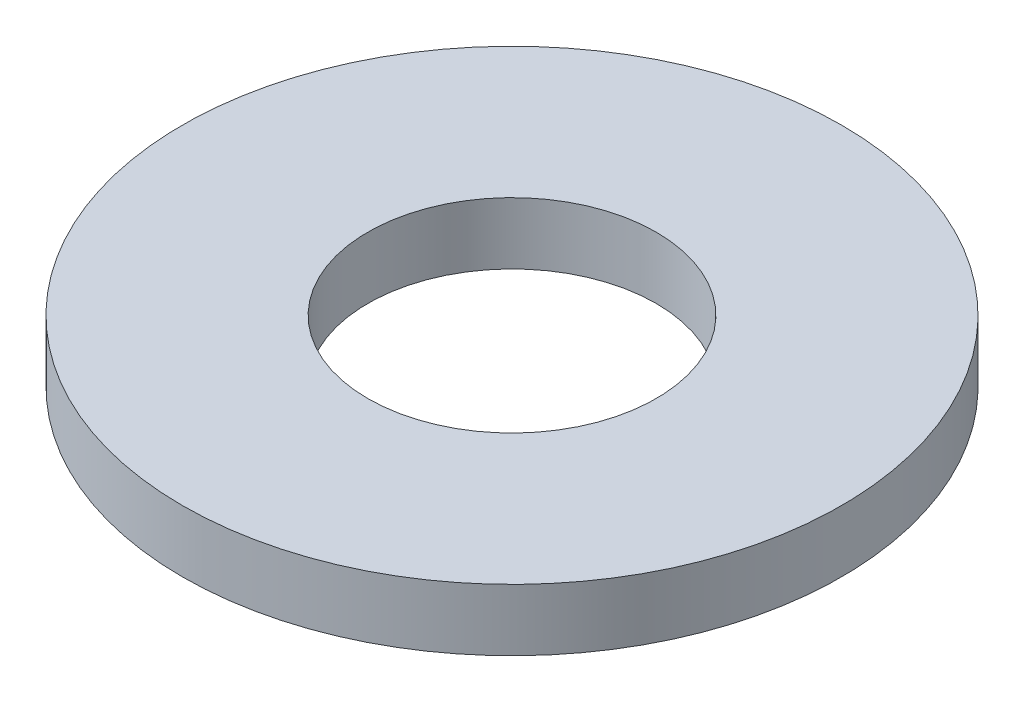
ISO-10303-21;
HEADER;
FILE_DESCRIPTION(('STEP AP214'),'2;1');
FILE_NAME('part.step','',(''),(''),'','','');
FILE_SCHEMA(('AUTOMOTIVE_DESIGN { 1 0 10303 214 1 1 1 1 }'));
ENDSEC;
DATA;
#1=APPLICATION_CONTEXT('core data for automotive mechanical design processes');
#2=APPLICATION_PROTOCOL_DEFINITION('international standard','automotive_design',2000,#1);
#3=PRODUCT_CONTEXT('',#1,'mechanical');
#4=PRODUCT('Part','Part','',(#3));
#5=PRODUCT_RELATED_PRODUCT_CATEGORY('part','',(#4));
#6=PRODUCT_DEFINITION_FORMATION('','',#4);
#7=PRODUCT_DEFINITION_CONTEXT('part definition',#1,'design');
#8=PRODUCT_DEFINITION('design','',#6,#7);
#9=PRODUCT_DEFINITION_SHAPE('','',#8);
#10=(LENGTH_UNIT() NAMED_UNIT(*) SI_UNIT(.MILLI.,.METRE.));
#11=(NAMED_UNIT(*) PLANE_ANGLE_UNIT() SI_UNIT($,.RADIAN.));
#12=(NAMED_UNIT(*) SI_UNIT($,.STERADIAN.) SOLID_ANGLE_UNIT());
#13=UNCERTAINTY_MEASURE_WITH_UNIT(LENGTH_MEASURE(1.E-05),#10,'distance_accuracy_value','');
#14=(GEOMETRIC_REPRESENTATION_CONTEXT(3) GLOBAL_UNCERTAINTY_ASSIGNED_CONTEXT((#13)) GLOBAL_UNIT_ASSIGNED_CONTEXT((#10,
#11,#12)) REPRESENTATION_CONTEXT('',''));
#15=CARTESIAN_POINT('',(0.,0.,0.));
#16=DIRECTION('',(0.,0.,1.));
#17=DIRECTION('',(1.,0.,0.));
#18=AXIS2_PLACEMENT_3D('',#15,#16,#17);
#19=CARTESIAN_POINT('',(0.,1.524,0.));
#20=DIRECTION('',(0.,1.,0.));
#21=DIRECTION('',(0.,0.,1.));
#22=AXIS2_PLACEMENT_3D('',#19,#20,#21);
#23=PLANE('',#22);
#24=CARTESIAN_POINT('',(0.,1.524,0.));
#25=DIRECTION('',(0.,1.,0.));
#26=DIRECTION('',(0.,0.,1.));
#27=AXIS2_PLACEMENT_3D('',#24,#25,#26);
#28=CIRCLE('',#27,8.128);
#29=CARTESIAN_POINT('',(0.,1.524,-8.128));
#30=VERTEX_POINT('',#29);
#31=EDGE_CURVE('E10',#30,#30,#28,.T.);
#32=ORIENTED_EDGE('',*,*,#31,.T.);
#33=EDGE_LOOP('',(#32));
#34=FACE_BOUND('',#33,.T.);
#35=CARTESIAN_POINT('',(0.,1.524,0.));
#36=DIRECTION('',(0.,1.,0.));
#37=DIRECTION('',(0.,0.,1.));
#38=AXIS2_PLACEMENT_3D('',#35,#36,#37);
#39=CIRCLE('',#38,3.556);
#40=CARTESIAN_POINT('',(0.,1.524,-3.556));
#41=VERTEX_POINT('',#40);
#42=EDGE_CURVE('E45',#41,#41,#39,.T.);
#43=ORIENTED_EDGE('',*,*,#42,.F.);
#44=EDGE_LOOP('',(#43));
#45=FACE_BOUND('',#44,.T.);
#46=ADVANCED_FACE('F34',(#34,#45),#23,.T.);
#47=CARTESIAN_POINT('',(0.,0.,0.));
#48=DIRECTION('',(0.,1.,0.));
#49=DIRECTION('',(0.,0.,1.));
#50=AXIS2_PLACEMENT_3D('',#47,#48,#49);
#51=PLANE('',#50);
#52=CARTESIAN_POINT('',(0.,0.,0.));
#53=DIRECTION('',(0.,1.,0.));
#54=DIRECTION('',(0.,0.,1.));
#55=AXIS2_PLACEMENT_3D('',#52,#53,#54);
#56=CIRCLE('',#55,8.128);
#57=CARTESIAN_POINT('',(0.,0.,-8.128));
#58=VERTEX_POINT('',#57);
#59=EDGE_CURVE('E38',#58,#58,#56,.T.);
#60=ORIENTED_EDGE('',*,*,#59,.F.);
#61=EDGE_LOOP('',(#60));
#62=FACE_BOUND('',#61,.T.);
#63=CARTESIAN_POINT('',(0.,0.,0.));
#64=DIRECTION('',(0.,1.,0.));
#65=DIRECTION('',(0.,0.,1.));
#66=AXIS2_PLACEMENT_3D('',#63,#64,#65);
#67=CIRCLE('',#66,3.556);
#68=CARTESIAN_POINT('',(0.,0.,-3.556));
#69=VERTEX_POINT('',#68);
#70=EDGE_CURVE('E47',#69,#69,#67,.T.);
#71=ORIENTED_EDGE('',*,*,#70,.T.);
#72=EDGE_LOOP('',(#71));
#73=FACE_BOUND('',#72,.T.);
#74=ADVANCED_FACE('F57',(#62,#73),#51,.F.);
#75=CARTESIAN_POINT('',(0.,1.524,0.));
#76=DIRECTION('',(0.,-1.,0.));
#77=DIRECTION('',(0.,0.,-1.));
#78=AXIS2_PLACEMENT_3D('',#75,#76,#77);
#79=CYLINDRICAL_SURFACE('',#78,8.128);
#80=CARTESIAN_POINT('',(0.,1.524,-8.128));
#81=CARTESIAN_POINT('',(0.,1.508125,-8.128));
#82=CARTESIAN_POINT('',(0.,1.49225,-8.128));
#83=CARTESIAN_POINT('',(0.,1.4605,-8.128));
#84=CARTESIAN_POINT('',(0.,1.444625,-8.128));
#85=CARTESIAN_POINT('',(0.,1.412875,-8.128));
#86=CARTESIAN_POINT('',(0.,1.397,-8.128));
#87=CARTESIAN_POINT('',(0.,1.36525,-8.128));
#88=CARTESIAN_POINT('',(0.,1.349375,-8.128));
#89=CARTESIAN_POINT('',(0.,1.317625,-8.128));
#90=CARTESIAN_POINT('',(0.,1.30175,-8.128));
#91=CARTESIAN_POINT('',(0.,1.27,-8.128));
#92=CARTESIAN_POINT('',(0.,1.254125,-8.128));
#93=CARTESIAN_POINT('',(0.,1.222375,-8.128));
#94=CARTESIAN_POINT('',(0.,1.2065,-8.128));
#95=CARTESIAN_POINT('',(0.,1.17475,-8.128));
#96=CARTESIAN_POINT('',(0.,1.158875,-8.128));
#97=CARTESIAN_POINT('',(0.,1.127125,-8.128));
#98=CARTESIAN_POINT('',(0.,1.11125,-8.128));
#99=CARTESIAN_POINT('',(0.,1.0795,-8.128));
#100=CARTESIAN_POINT('',(0.,1.063625,-8.128));
#101=CARTESIAN_POINT('',(0.,1.031875,-8.128));
#102=CARTESIAN_POINT('',(0.,1.016,-8.128));
#103=CARTESIAN_POINT('',(0.,0.98425,-8.128));
#104=CARTESIAN_POINT('',(0.,0.968375,-8.128));
#105=CARTESIAN_POINT('',(0.,0.936625,-8.128));
#106=CARTESIAN_POINT('',(0.,0.92075,-8.128));
#107=CARTESIAN_POINT('',(0.,0.889,-8.128));
#108=CARTESIAN_POINT('',(0.,0.873125,-8.128));
#109=CARTESIAN_POINT('',(0.,0.841375,-8.128));
#110=CARTESIAN_POINT('',(0.,0.8255,-8.128));
#111=CARTESIAN_POINT('',(0.,0.79375,-8.128));
#112=CARTESIAN_POINT('',(0.,0.777875,-8.128));
#113=CARTESIAN_POINT('',(0.,0.746125,-8.128));
#114=CARTESIAN_POINT('',(0.,0.73025,-8.128));
#115=CARTESIAN_POINT('',(0.,0.6985,-8.128));
#116=CARTESIAN_POINT('',(0.,0.682625,-8.128));
#117=CARTESIAN_POINT('',(0.,0.650875,-8.128));
#118=CARTESIAN_POINT('',(0.,0.635,-8.128));
#119=CARTESIAN_POINT('',(0.,0.60325,-8.128));
#120=CARTESIAN_POINT('',(0.,0.587375,-8.128));
#121=CARTESIAN_POINT('',(0.,0.555625,-8.128));
#122=CARTESIAN_POINT('',(0.,0.53975,-8.128));
#123=CARTESIAN_POINT('',(0.,0.508,-8.128));
#124=CARTESIAN_POINT('',(0.,0.492125,-8.128));
#125=CARTESIAN_POINT('',(0.,0.460375,-8.128));
#126=CARTESIAN_POINT('',(0.,0.4445,-8.128));
#127=CARTESIAN_POINT('',(0.,0.41275,-8.128));
#128=CARTESIAN_POINT('',(0.,0.396875,-8.128));
#129=CARTESIAN_POINT('',(0.,0.365125,-8.128));
#130=CARTESIAN_POINT('',(0.,0.34925,-8.128));
#131=CARTESIAN_POINT('',(0.,0.3175,-8.128));
#132=CARTESIAN_POINT('',(0.,0.301625,-8.128));
#133=CARTESIAN_POINT('',(0.,0.269875,-8.128));
#134=CARTESIAN_POINT('',(0.,0.254,-8.128));
#135=CARTESIAN_POINT('',(0.,0.22225,-8.128));
#136=CARTESIAN_POINT('',(0.,0.206375,-8.128));
#137=CARTESIAN_POINT('',(0.,0.174625,-8.128));
#138=CARTESIAN_POINT('',(0.,0.15875,-8.128));
#139=CARTESIAN_POINT('',(0.,0.127,-8.128));
#140=CARTESIAN_POINT('',(0.,0.111125,-8.128));
#141=CARTESIAN_POINT('',(0.,0.079375,-8.128));
#142=CARTESIAN_POINT('',(0.,0.0635,-8.128));
#143=CARTESIAN_POINT('',(0.,0.0317499999999999,-8.128));
#144=CARTESIAN_POINT('',(0.,0.015875,-8.128));
#145=CARTESIAN_POINT('',(0.,0.,-8.128));
#146=B_SPLINE_CURVE_WITH_KNOTS('',3,(#80,#81,#82,#83,#84,#85,#86,#87,#88,#89,#90,#91,#92,#93,
#94,#95,#96,#97,#98,#99,#100,#101,#102,#103,#104,#105,#106,#107,#108,#109,#110,#111,#112,#113,
#114,#115,#116,#117,#118,#119,#120,#121,#122,#123,#124,#125,#126,#127,#128,#129,#130,#131,#132,
#133,#134,#135,#136,#137,#138,#139,#140,#141,#142,#143,#144,#145),.UNSPECIFIED.,.F.,.F.,(4,2,2,
2,2,2,2,2,2,2,2,2,2,2,2,2,2,2,2,2,2,2,2,2,2,2,2,2,2,2,2,2,4),(0.,0.0476249999999999,
0.0952499999999998,0.142875,0.1905,0.238125,0.28575,0.333375,0.381,0.428625,0.47625,0.523875,
0.5715,0.619125,0.66675,0.714375,0.762,0.809625,0.85725,0.904875,0.9525,1.000125,1.04775,
1.095375,1.143,1.190625,1.23825,1.285875,1.3335,1.381125,1.42875,1.476375,1.524),.UNSPECIFIED.);
#147=EDGE_CURVE('BSEAM36',#30,#58,#146,.T.);
#148=ORIENTED_EDGE('',*,*,#31,.F.);
#149=ORIENTED_EDGE('',*,*,#59,.T.);
#150=ORIENTED_EDGE('',*,*,#147,.T.);
#151=ORIENTED_EDGE('',*,*,#147,.F.);
#152=EDGE_LOOP('',(#148,#150,#149,#151));
#153=FACE_BOUND('',#152,.T.);
#154=ADVANCED_FACE('F36',(#153),#79,.T.);
#155=CARTESIAN_POINT('',(0.,1.524,0.));
#156=DIRECTION('',(0.,-1.,0.));
#157=DIRECTION('',(0.,0.,-1.));
#158=AXIS2_PLACEMENT_3D('',#155,#156,#157);
#159=CYLINDRICAL_SURFACE('',#158,3.556);
#160=CARTESIAN_POINT('',(0.,1.524,-3.556));
#161=CARTESIAN_POINT('',(0.,1.508125,-3.556));
#162=CARTESIAN_POINT('',(0.,1.49225,-3.556));
#163=CARTESIAN_POINT('',(0.,1.4605,-3.556));
#164=CARTESIAN_POINT('',(0.,1.444625,-3.556));
#165=CARTESIAN_POINT('',(0.,1.412875,-3.556));
#166=CARTESIAN_POINT('',(0.,1.397,-3.556));
#167=CARTESIAN_POINT('',(0.,1.36525,-3.556));
#168=CARTESIAN_POINT('',(0.,1.349375,-3.556));
#169=CARTESIAN_POINT('',(0.,1.317625,-3.556));
#170=CARTESIAN_POINT('',(0.,1.30175,-3.556));
#171=CARTESIAN_POINT('',(0.,1.27,-3.556));
#172=CARTESIAN_POINT('',(0.,1.254125,-3.556));
#173=CARTESIAN_POINT('',(0.,1.222375,-3.556));
#174=CARTESIAN_POINT('',(0.,1.2065,-3.556));
#175=CARTESIAN_POINT('',(0.,1.17475,-3.556));
#176=CARTESIAN_POINT('',(0.,1.158875,-3.556));
#177=CARTESIAN_POINT('',(0.,1.127125,-3.556));
#178=CARTESIAN_POINT('',(0.,1.11125,-3.556));
#179=CARTESIAN_POINT('',(0.,1.0795,-3.556));
#180=CARTESIAN_POINT('',(0.,1.063625,-3.556));
#181=CARTESIAN_POINT('',(0.,1.031875,-3.556));
#182=CARTESIAN_POINT('',(0.,1.016,-3.556));
#183=CARTESIAN_POINT('',(0.,0.98425,-3.556));
#184=CARTESIAN_POINT('',(0.,0.968375,-3.556));
#185=CARTESIAN_POINT('',(0.,0.936625,-3.556));
#186=CARTESIAN_POINT('',(0.,0.92075,-3.556));
#187=CARTESIAN_POINT('',(0.,0.889,-3.556));
#188=CARTESIAN_POINT('',(0.,0.873125,-3.556));
#189=CARTESIAN_POINT('',(0.,0.841375,-3.556));
#190=CARTESIAN_POINT('',(0.,0.8255,-3.556));
#191=CARTESIAN_POINT('',(0.,0.79375,-3.556));
#192=CARTESIAN_POINT('',(0.,0.777875,-3.556));
#193=CARTESIAN_POINT('',(0.,0.746125,-3.556));
#194=CARTESIAN_POINT('',(0.,0.73025,-3.556));
#195=CARTESIAN_POINT('',(0.,0.6985,-3.556));
#196=CARTESIAN_POINT('',(0.,0.682625,-3.556));
#197=CARTESIAN_POINT('',(0.,0.650875,-3.556));
#198=CARTESIAN_POINT('',(0.,0.635,-3.556));
#199=CARTESIAN_POINT('',(0.,0.60325,-3.556));
#200=CARTESIAN_POINT('',(0.,0.587375,-3.556));
#201=CARTESIAN_POINT('',(0.,0.555625,-3.556));
#202=CARTESIAN_POINT('',(0.,0.53975,-3.556));
#203=CARTESIAN_POINT('',(0.,0.508,-3.556));
#204=CARTESIAN_POINT('',(0.,0.492125,-3.556));
#205=CARTESIAN_POINT('',(0.,0.460375,-3.556));
#206=CARTESIAN_POINT('',(0.,0.4445,-3.556));
#207=CARTESIAN_POINT('',(0.,0.41275,-3.556));
#208=CARTESIAN_POINT('',(0.,0.396875,-3.556));
#209=CARTESIAN_POINT('',(0.,0.365125,-3.556));
#210=CARTESIAN_POINT('',(0.,0.34925,-3.556));
#211=CARTESIAN_POINT('',(0.,0.3175,-3.556));
#212=CARTESIAN_POINT('',(0.,0.301625,-3.556));
#213=CARTESIAN_POINT('',(0.,0.269875,-3.556));
#214=CARTESIAN_POINT('',(0.,0.254,-3.556));
#215=CARTESIAN_POINT('',(0.,0.22225,-3.556));
#216=CARTESIAN_POINT('',(0.,0.206375,-3.556));
#217=CARTESIAN_POINT('',(0.,0.174625,-3.556));
#218=CARTESIAN_POINT('',(0.,0.15875,-3.556));
#219=CARTESIAN_POINT('',(0.,0.127,-3.556));
#220=CARTESIAN_POINT('',(0.,0.111125,-3.556));
#221=CARTESIAN_POINT('',(0.,0.079375,-3.556));
#222=CARTESIAN_POINT('',(0.,0.0635,-3.556));
#223=CARTESIAN_POINT('',(0.,0.0317499999999999,-3.556));
#224=CARTESIAN_POINT('',(0.,0.015875,-3.556));
#225=CARTESIAN_POINT('',(0.,0.,-3.556));
#226=B_SPLINE_CURVE_WITH_KNOTS('',3,(#160,#161,#162,#163,#164,#165,#166,#167,#168,#169,#170,
#171,#172,#173,#174,#175,#176,#177,#178,#179,#180,#181,#182,#183,#184,#185,#186,#187,#188,#189,
#190,#191,#192,#193,#194,#195,#196,#197,#198,#199,#200,#201,#202,#203,#204,#205,#206,#207,#208,
#209,#210,#211,#212,#213,#214,#215,#216,#217,#218,#219,#220,#221,#222,#223,#224,#225),
.UNSPECIFIED.,.F.,.F.,(4,2,2,2,2,2,2,2,2,2,2,2,2,2,2,2,2,2,2,2,2,2,2,2,2,2,2,2,2,2,2,2,4),(0.,
0.0476249999999999,0.0952499999999998,0.142875,0.1905,0.238125,0.28575,0.333375,0.381,0.428625,
0.47625,0.523875,0.5715,0.619125,0.66675,0.714375,0.762,0.809625,0.85725,0.904875,0.9525,
1.000125,1.04775,1.095375,1.143,1.190625,1.23825,1.285875,1.3335,1.381125,1.42875,1.476375,
1.524),.UNSPECIFIED.);
#227=EDGE_CURVE('BSEAM53',#41,#69,#226,.T.);
#228=ORIENTED_EDGE('',*,*,#42,.T.);
#229=ORIENTED_EDGE('',*,*,#70,.F.);
#230=ORIENTED_EDGE('',*,*,#227,.T.);
#231=ORIENTED_EDGE('',*,*,#227,.F.);
#232=EDGE_LOOP('',(#228,#230,#229,#231));
#233=FACE_BOUND('',#232,.T.);
#234=ADVANCED_FACE('F53',(#233),#159,.F.);
#235=CLOSED_SHELL('',(#46,#74,#154,#234));
#236=MANIFOLD_SOLID_BREP('B2',#235);
#237=ADVANCED_BREP_SHAPE_REPRESENTATION('',(#18,#236),#14);
#238=SHAPE_DEFINITION_REPRESENTATION(#9,#237);
ENDSEC;
END-ISO-10303-21;
